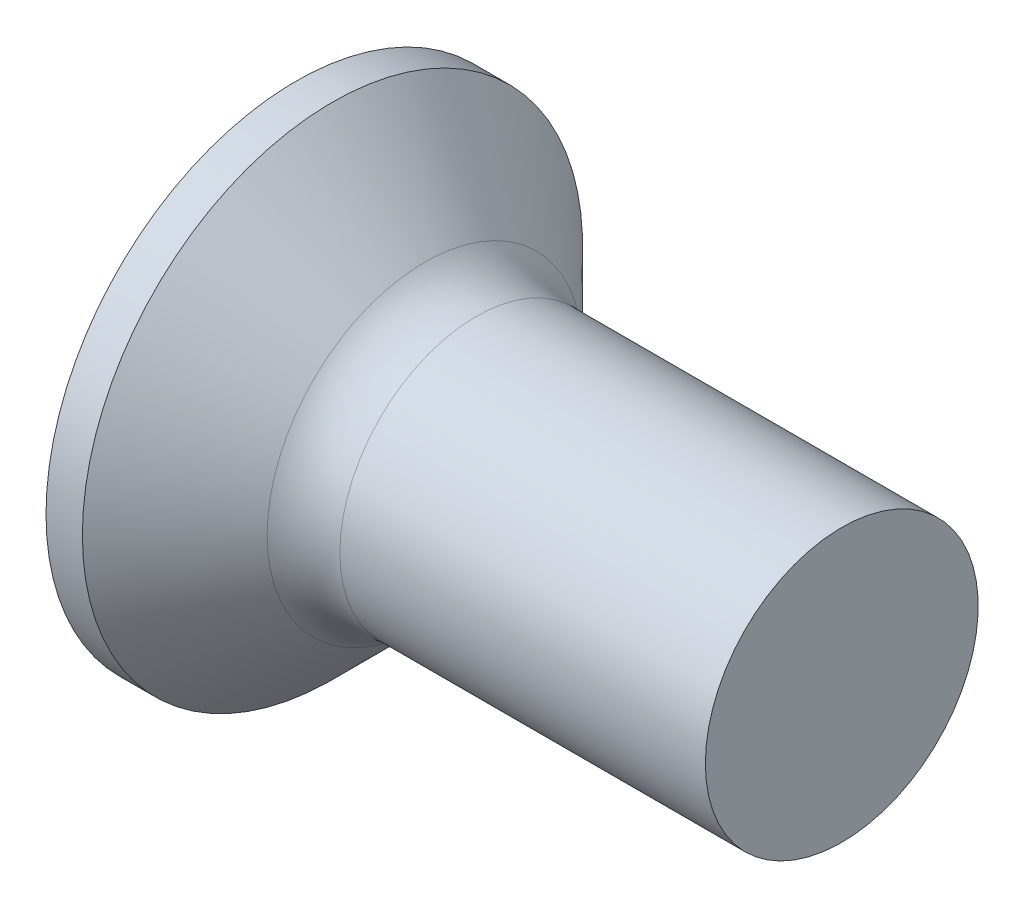
ISO-10303-21;
HEADER;
FILE_DESCRIPTION(('STEP AP214'),'2;1');
FILE_NAME('part.step','',(''),(''),'','','');
FILE_SCHEMA(('AUTOMOTIVE_DESIGN { 1 0 10303 214 1 1 1 1 }'));
ENDSEC;
DATA;
#1=APPLICATION_CONTEXT('core data for automotive mechanical design processes');
#2=APPLICATION_PROTOCOL_DEFINITION('international standard','automotive_design',2000,#1);
#3=PRODUCT_CONTEXT('',#1,'mechanical');
#4=PRODUCT('Part','Part','',(#3));
#5=PRODUCT_RELATED_PRODUCT_CATEGORY('part','',(#4));
#6=PRODUCT_DEFINITION_FORMATION('','',#4);
#7=PRODUCT_DEFINITION_CONTEXT('part definition',#1,'design');
#8=PRODUCT_DEFINITION('design','',#6,#7);
#9=PRODUCT_DEFINITION_SHAPE('','',#8);
#10=(LENGTH_UNIT() NAMED_UNIT(*) SI_UNIT(.MILLI.,.METRE.));
#11=(NAMED_UNIT(*) PLANE_ANGLE_UNIT() SI_UNIT($,.RADIAN.));
#12=(NAMED_UNIT(*) SI_UNIT($,.STERADIAN.) SOLID_ANGLE_UNIT());
#13=UNCERTAINTY_MEASURE_WITH_UNIT(LENGTH_MEASURE(1.E-05),#10,'distance_accuracy_value','');
#14=(GEOMETRIC_REPRESENTATION_CONTEXT(3) GLOBAL_UNCERTAINTY_ASSIGNED_CONTEXT((#13)) GLOBAL_UNIT_ASSIGNED_CONTEXT((#10,
#11,#12)) REPRESENTATION_CONTEXT('',''));
#15=CARTESIAN_POINT('',(0.,0.,0.));
#16=DIRECTION('',(0.,0.,1.));
#17=DIRECTION('',(1.,0.,0.));
#18=AXIS2_PLACEMENT_3D('',#15,#16,#17);
#19=CARTESIAN_POINT('',(5.75178571428571,0.,0.));
#20=DIRECTION('',(-1.,0.,0.));
#21=DIRECTION('',(0.,-1.,0.));
#22=AXIS2_PLACEMENT_3D('',#19,#20,#21);
#23=SPHERICAL_SURFACE('',#22,5.75178571428571);
#24=CARTESIAN_POINT('',(0.699999999999999,0.,0.));
#25=DIRECTION('',(-1.,0.,0.));
#26=DIRECTION('',(0.,0.,1.));
#27=AXIS2_PLACEMENT_3D('',#24,#25,#26);
#28=CIRCLE('',#27,2.75);
#29=CARTESIAN_POINT('',(0.699999999999999,0.,2.75));
#30=VERTEX_POINT('',#29);
#31=EDGE_CURVE('E223',#30,#30,#28,.T.);
#32=ORIENTED_EDGE('',*,*,#31,.T.);
#33=EDGE_LOOP('',(#32));
#34=FACE_BOUND('',#33,.T.);
#35=CARTESIAN_POINT('',(5.75178571428571,0.369999999999999,0.));
#36=DIRECTION('',(0.,-1.,0.));
#37=DIRECTION('',(0.,0.,-1.));
#38=AXIS2_PLACEMENT_3D('',#35,#36,#37);
#39=CIRCLE('',#38,5.73987272533644);
#40=CARTESIAN_POINT('',(0.198367443424474,0.370000000000005,-1.45109765761156));
#41=VERTEX_POINT('',#40);
#42=CARTESIAN_POINT('',(0.0425671244924349,0.370000000000002,-0.592420456280884));
#43=VERTEX_POINT('',#42);
#44=EDGE_CURVE('E304',#41,#43,#39,.F.);
#45=ORIENTED_EDGE('',*,*,#44,.T.);
#46=CARTESIAN_POINT('',(0.0425671244924332,0.,0.));
#47=DIRECTION('',(1.,0.,0.));
#48=DIRECTION('',(0.,0.,-1.));
#49=AXIS2_PLACEMENT_3D('',#46,#47,#48);
#50=CIRCLE('',#49,0.698471185533127);
#51=CARTESIAN_POINT('',(0.0425671244924336,0.592420456280881,-0.37));
#52=VERTEX_POINT('',#51);
#53=EDGE_CURVE('E340',#43,#52,#50,.T.);
#54=ORIENTED_EDGE('',*,*,#53,.T.);
#55=CARTESIAN_POINT('',(5.75178571428571,0.,-0.369999999999999));
#56=DIRECTION('',(0.,0.,1.));
#57=DIRECTION('',(1.,0.,0.));
#58=AXIS2_PLACEMENT_3D('',#55,#56,#57);
#59=CIRCLE('',#58,5.73987272533644);
#60=CARTESIAN_POINT('',(0.198367443424474,1.45109765761157,-0.37));
#61=VERTEX_POINT('',#60);
#62=EDGE_CURVE('E245',#52,#61,#59,.F.);
#63=ORIENTED_EDGE('',*,*,#62,.T.);
#64=CARTESIAN_POINT('',(5.22559114829425,-1.05538320204419,0.));
#65=DIRECTION('',(0.446197753347436,0.894934391398443,0.));
#66=DIRECTION('',(-0.894934391398443,0.446197753347436,0.));
#67=AXIS2_PLACEMENT_3D('',#64,#65,#66);
#68=CIRCLE('',#67,5.629593633525);
#69=CARTESIAN_POINT('',(0.198367443424474,1.45109765761157,0.370000000000001));
#70=VERTEX_POINT('',#69);
#71=EDGE_CURVE('E249',#70,#61,#68,.F.);
#72=ORIENTED_EDGE('',*,*,#71,.F.);
#73=CARTESIAN_POINT('',(5.75178571428571,0.,0.370000000000002));
#74=DIRECTION('',(0.,0.,-1.));
#75=DIRECTION('',(-1.,0.,0.));
#76=AXIS2_PLACEMENT_3D('',#73,#74,#75);
#77=CIRCLE('',#76,5.73987272533644);
#78=CARTESIAN_POINT('',(0.0425671244924336,0.592420456280882,0.369999999999999));
#79=VERTEX_POINT('',#78);
#80=EDGE_CURVE('E242',#70,#79,#77,.F.);
#81=ORIENTED_EDGE('',*,*,#80,.T.);
#82=CARTESIAN_POINT('',(0.0425671244924352,0.369999999999998,0.592420456280886));
#83=VERTEX_POINT('',#82);
#84=EDGE_CURVE('E728',#79,#83,#50,.T.);
#85=ORIENTED_EDGE('',*,*,#84,.T.);
#86=CARTESIAN_POINT('',(0.198367443424474,0.369999999999995,1.45109765761157));
#87=VERTEX_POINT('',#86);
#88=EDGE_CURVE('E271',#83,#87,#39,.F.);
#89=ORIENTED_EDGE('',*,*,#88,.T.);
#90=CARTESIAN_POINT('',(5.22559114829425,0.,-1.05538320204419));
#91=DIRECTION('',(0.446197753347436,0.,0.894934391398443));
#92=DIRECTION('',(0.894934391398443,0.,-0.446197753347436));
#93=AXIS2_PLACEMENT_3D('',#90,#91,#92);
#94=CIRCLE('',#93,5.629593633525);
#95=CARTESIAN_POINT('',(0.198367443424474,-0.370000000000006,1.45109765761156));
#96=VERTEX_POINT('',#95);
#97=EDGE_CURVE('E43',#96,#87,#94,.F.);
#98=ORIENTED_EDGE('',*,*,#97,.F.);
#99=CARTESIAN_POINT('',(5.75178571428571,-0.370000000000002,0.));
#100=DIRECTION('',(0.,1.,0.));
#101=DIRECTION('',(0.,0.,1.));
#102=AXIS2_PLACEMENT_3D('',#99,#100,#101);
#103=CIRCLE('',#102,5.73987272533644);
#104=CARTESIAN_POINT('',(0.0425671244924341,-0.370000000000001,0.592420456280884));
#105=VERTEX_POINT('',#104);
#106=EDGE_CURVE('E275',#96,#105,#103,.F.);
#107=ORIENTED_EDGE('',*,*,#106,.T.);
#108=CARTESIAN_POINT('',(0.0425671244924336,-0.592420456280882,0.369999999999999));
#109=VERTEX_POINT('',#108);
#110=EDGE_CURVE('E423',#105,#109,#50,.T.);
#111=ORIENTED_EDGE('',*,*,#110,.T.);
#112=CARTESIAN_POINT('',(0.198367443424474,-1.45109765761156,0.369999999999999));
#113=VERTEX_POINT('',#112);
#114=EDGE_CURVE('E241',#109,#113,#77,.F.);
#115=ORIENTED_EDGE('',*,*,#114,.T.);
#116=CARTESIAN_POINT('',(5.22559114829425,1.05538320204419,0.));
#117=DIRECTION('',(0.446197753347435,-0.894934391398443,0.));
#118=DIRECTION('',(0.894934391398443,0.446197753347435,0.));
#119=AXIS2_PLACEMENT_3D('',#116,#117,#118);
#120=CIRCLE('',#119,5.629593633525);
#121=CARTESIAN_POINT('',(0.198367443424474,-1.45109765761156,-0.37));
#122=VERTEX_POINT('',#121);
#123=EDGE_CURVE('E239',#122,#113,#120,.F.);
#124=ORIENTED_EDGE('',*,*,#123,.F.);
#125=CARTESIAN_POINT('',(0.0425671244924336,-0.592420456280881,-0.37));
#126=VERTEX_POINT('',#125);
#127=EDGE_CURVE('E246',#122,#126,#59,.F.);
#128=ORIENTED_EDGE('',*,*,#127,.T.);
#129=CARTESIAN_POINT('',(0.0425671244924348,-0.369999999999997,-0.592420456280887));
#130=VERTEX_POINT('',#129);
#131=EDGE_CURVE('E371',#126,#130,#50,.T.);
#132=ORIENTED_EDGE('',*,*,#131,.T.);
#133=CARTESIAN_POINT('',(0.198367443424474,-0.369999999999994,-1.45109765761156));
#134=VERTEX_POINT('',#133);
#135=EDGE_CURVE('E277',#130,#134,#103,.F.);
#136=ORIENTED_EDGE('',*,*,#135,.T.);
#137=CARTESIAN_POINT('',(5.22559114829425,0.,1.05538320204419));
#138=DIRECTION('',(0.446197753347435,0.,-0.894934391398443));
#139=DIRECTION('',(-0.894934391398443,0.,-0.446197753347435));
#140=AXIS2_PLACEMENT_3D('',#137,#138,#139);
#141=CIRCLE('',#140,5.629593633525);
#142=EDGE_CURVE('E252',#41,#134,#141,.F.);
#143=ORIENTED_EDGE('',*,*,#142,.F.);
#144=EDGE_LOOP('',(#45,#54,#63,#72,#81,#85,#89,#98,#107,#111,#115,#124,#128,#132,#136,#143));
#145=FACE_BOUND('',#144,.T.);
#146=ADVANCED_FACE('F35',(#34,#145),#23,.T.);
#147=CARTESIAN_POINT('',(2.08,0.512950428676215,-0.37));
#148=DIRECTION('',(0.,0.,1.));
#149=DIRECTION('',(1.,0.,0.));
#150=AXIS2_PLACEMENT_3D('',#147,#148,#149);
#151=PLANE('',#150);
#152=ORIENTED_EDGE('',*,*,#62,.F.);
#153=CARTESIAN_POINT('',(-0.986108633839049,0.675737444130956,-0.37));
#154=CARTESIAN_POINT('',(-0.774401024917671,0.658853686256421,-0.37));
#155=CARTESIAN_POINT('',(-0.56270392162146,0.641835849346198,-0.37));
#156=CARTESIAN_POINT('',(-0.139335591881705,0.607430344801114,-0.37));
#157=CARTESIAN_POINT('',(0.0723356339683206,0.590042669870087,-0.37));
#158=CARTESIAN_POINT('',(0.495638906041735,0.554796481702076,-0.37));
#159=CARTESIAN_POINT('',(0.707270952279083,0.536937968633181,-0.37));
#160=CARTESIAN_POINT('',(1.13047821918516,0.500589740538851,-0.37));
#161=CARTESIAN_POINT('',(1.34205344057783,0.482100033980559,-0.37));
#162=CARTESIAN_POINT('',(1.7126422349985,0.448931877712391,-0.37));
#163=CARTESIAN_POINT('',(1.87167298820047,0.434445978314768,-0.37));
#164=CARTESIAN_POINT('',(2.18967047903985,0.404800340258253,-0.37));
#165=CARTESIAN_POINT('',(2.34863721722438,0.3896406074874,-0.37));
#166=CARTESIAN_POINT('',(2.66648832719461,0.358378663830571,-0.37));
#167=CARTESIAN_POINT('',(2.82537269367797,0.342276398422203,-0.37));
#168=CARTESIAN_POINT('',(3.06358912313363,0.31705487368504,-0.37));
#169=CARTESIAN_POINT('',(3.14297750534347,0.308469532933521,-0.37));
#170=CARTESIAN_POINT('',(3.30170304596355,0.290830230925067,-0.37));
#171=CARTESIAN_POINT('',(3.38104020374595,0.281776264030691,-0.37));
#172=CARTESIAN_POINT('',(3.460343956577,0.27243176300921,-0.37));
#173=B_SPLINE_CURVE_WITH_KNOTS('',3,(#153,#154,#155,#156,#157,#158,#159,#160,#161,#162,#163,
#164,#165,#166,#167,#168,#169,#170,#171,#172),.UNSPECIFIED.,.F.,.F.,(4,2,2,2,2,2,2,2,2,4),(0.,
0.637139595455107,1.27429177208145,1.91144372124687,2.54858712669655,3.02765347728825,
3.50671564256163,3.98580554743446,4.22535810389142,4.46491354276891),.UNSPECIFIED.);
#174=CARTESIAN_POINT('',(2.08,0.415013252800436,-0.37));
#175=VERTEX_POINT('',#174);
#176=EDGE_CURVE('E396',#52,#175,#173,.T.);
#177=ORIENTED_EDGE('',*,*,#176,.T.);
#178=DIRECTION('',(0.,1.,0.));
#179=VECTOR('',#178,1.);
#180=CARTESIAN_POINT('',(2.08,-0.512950428676216,-0.37));
#181=LINE('',#180,#179);
#182=CARTESIAN_POINT('',(2.08,0.512950428676216,-0.37));
#183=VERTEX_POINT('',#182);
#184=EDGE_CURVE('E331',#175,#183,#181,.T.);
#185=ORIENTED_EDGE('',*,*,#184,.T.);
#186=DIRECTION('',(0.894934391398442,-0.446197753347436,0.));
#187=VECTOR('',#186,1.);
#188=CARTESIAN_POINT('',(0.,1.55,-0.37));
#189=LINE('',#188,#187);
#190=EDGE_CURVE('E220',#61,#183,#189,.T.);
#191=ORIENTED_EDGE('',*,*,#190,.F.);
#192=EDGE_LOOP('',(#152,#177,#185,#191));
#193=FACE_BOUND('',#192,.T.);
#194=ADVANCED_FACE('F188',(#193),#151,.T.);
#195=CARTESIAN_POINT('',(2.08,-0.512950428676216,-0.37));
#196=VERTEX_POINT('',#195);
#197=CARTESIAN_POINT('',(2.08,-0.415013252800436,-0.37));
#198=VERTEX_POINT('',#197);
#199=EDGE_CURVE('E229',#196,#198,#181,.T.);
#200=ORIENTED_EDGE('',*,*,#199,.T.);
#201=CARTESIAN_POINT('',(-0.986108633839049,-0.675737444130956,-0.37));
#202=CARTESIAN_POINT('',(-0.774401024917671,-0.658853686256421,-0.37));
#203=CARTESIAN_POINT('',(-0.56270392162146,-0.641835849346198,-0.37));
#204=CARTESIAN_POINT('',(-0.139335591881705,-0.607430344801114,-0.37));
#205=CARTESIAN_POINT('',(0.0723356339683208,-0.590042669870087,-0.37));
#206=CARTESIAN_POINT('',(0.495638906041735,-0.554796481702076,-0.37));
#207=CARTESIAN_POINT('',(0.707270952279084,-0.536937968633181,-0.37));
#208=CARTESIAN_POINT('',(1.13047821918516,-0.500589740538851,-0.37));
#209=CARTESIAN_POINT('',(1.34205344057783,-0.482100033980558,-0.37));
#210=CARTESIAN_POINT('',(1.7126422349985,-0.44893187771239,-0.37));
#211=CARTESIAN_POINT('',(1.87167298820047,-0.434445978314767,-0.37));
#212=CARTESIAN_POINT('',(2.18967047903985,-0.404800340258253,-0.37));
#213=CARTESIAN_POINT('',(2.34863721722438,-0.3896406074874,-0.37));
#214=CARTESIAN_POINT('',(2.66648832719461,-0.358378663830571,-0.37));
#215=CARTESIAN_POINT('',(2.82537269367797,-0.342276398422203,-0.37));
#216=CARTESIAN_POINT('',(3.06358912313363,-0.31705487368504,-0.37));
#217=CARTESIAN_POINT('',(3.14297750534347,-0.30846953293352,-0.37));
#218=CARTESIAN_POINT('',(3.30170304596355,-0.290830230925067,-0.37));
#219=CARTESIAN_POINT('',(3.38104020374595,-0.281776264030691,-0.37));
#220=CARTESIAN_POINT('',(3.460343956577,-0.27243176300921,-0.37));
#221=B_SPLINE_CURVE_WITH_KNOTS('',3,(#201,#202,#203,#204,#205,#206,#207,#208,#209,#210,#211,
#212,#213,#214,#215,#216,#217,#218,#219,#220),.UNSPECIFIED.,.F.,.F.,(4,2,2,2,2,2,2,2,2,4),(0.,
0.637139595455106,1.27429177208145,1.91144372124687,2.54858712669655,3.02765347728825,
3.50671564256163,3.98580554743446,4.22535810389142,4.46491354276891),.UNSPECIFIED.);
#222=EDGE_CURVE('E383',#198,#126,#221,.F.);
#223=ORIENTED_EDGE('',*,*,#222,.T.);
#224=ORIENTED_EDGE('',*,*,#127,.F.);
#225=DIRECTION('',(0.894934391398443,0.446197753347435,0.));
#226=VECTOR('',#225,1.);
#227=CARTESIAN_POINT('',(0.,-1.55,-0.37));
#228=LINE('',#227,#226);
#229=EDGE_CURVE('E58',#122,#196,#228,.T.);
#230=ORIENTED_EDGE('',*,*,#229,.T.);
#231=EDGE_LOOP('',(#200,#223,#224,#230));
#232=FACE_BOUND('',#231,.T.);
#233=ADVANCED_FACE('F194',(#232),#151,.T.);
#234=CARTESIAN_POINT('',(2.08,-0.512950428676216,0.37));
#235=DIRECTION('',(0.,0.,-1.));
#236=DIRECTION('',(-1.,0.,0.));
#237=AXIS2_PLACEMENT_3D('',#234,#235,#236);
#238=PLANE('',#237);
#239=DIRECTION('',(0.,-1.,0.));
#240=VECTOR('',#239,1.);
#241=CARTESIAN_POINT('',(2.08,0.512950428676216,0.37));
#242=LINE('',#241,#240);
#243=CARTESIAN_POINT('',(2.08,0.512950428676216,0.37));
#244=VERTEX_POINT('',#243);
#245=CARTESIAN_POINT('',(2.08,0.415013252800436,0.37));
#246=VERTEX_POINT('',#245);
#247=EDGE_CURVE('E315',#244,#246,#242,.T.);
#248=ORIENTED_EDGE('',*,*,#247,.T.);
#249=CARTESIAN_POINT('',(-0.986108633839049,0.675737444130957,0.369999999999999));
#250=CARTESIAN_POINT('',(-0.774401024917671,0.658853686256422,0.369999999999999));
#251=CARTESIAN_POINT('',(-0.56270392162146,0.641835849346199,0.369999999999999));
#252=CARTESIAN_POINT('',(-0.139335591881705,0.607430344801115,0.369999999999999));
#253=CARTESIAN_POINT('',(0.0723356339683208,0.590042669870088,0.369999999999999));
#254=CARTESIAN_POINT('',(0.495638906041735,0.554796481702077,0.369999999999999));
#255=CARTESIAN_POINT('',(0.707270952279083,0.536937968633182,0.369999999999999));
#256=CARTESIAN_POINT('',(1.13047821918516,0.500589740538852,0.37));
#257=CARTESIAN_POINT('',(1.34205344057783,0.482100033980559,0.37));
#258=CARTESIAN_POINT('',(1.7126422349985,0.448931877712391,0.37));
#259=CARTESIAN_POINT('',(1.87167298820047,0.434445978314768,0.37));
#260=CARTESIAN_POINT('',(2.18967047903985,0.404800340258252,0.37));
#261=CARTESIAN_POINT('',(2.34863721722438,0.389640607487399,0.37));
#262=CARTESIAN_POINT('',(2.66648832719461,0.358378663830571,0.37));
#263=CARTESIAN_POINT('',(2.82537269367797,0.342276398422203,0.37));
#264=CARTESIAN_POINT('',(3.06358912313363,0.31705487368504,0.37));
#265=CARTESIAN_POINT('',(3.14297750534347,0.30846953293352,0.37));
#266=CARTESIAN_POINT('',(3.30170304596355,0.290830230925066,0.370000000000001));
#267=CARTESIAN_POINT('',(3.38104020374595,0.28177626403069,0.370000000000001));
#268=CARTESIAN_POINT('',(3.460343956577,0.272431763009209,0.370000000000001));
#269=B_SPLINE_CURVE_WITH_KNOTS('',3,(#249,#250,#251,#252,#253,#254,#255,#256,#257,#258,#259,
#260,#261,#262,#263,#264,#265,#266,#267,#268),.UNSPECIFIED.,.F.,.F.,(4,2,2,2,2,2,2,2,2,4),(0.,
0.637139595455107,1.27429177208145,1.91144372124687,2.54858712669655,3.02765347728825,
3.50671564256163,3.98580554743446,4.22535810389142,4.46491354276891),.UNSPECIFIED.);
#270=EDGE_CURVE('E410',#246,#79,#269,.F.);
#271=ORIENTED_EDGE('',*,*,#270,.T.);
#272=ORIENTED_EDGE('',*,*,#80,.F.);
#273=DIRECTION('',(0.894934391398442,-0.446197753347436,0.));
#274=VECTOR('',#273,1.);
#275=CARTESIAN_POINT('',(0.,1.55,0.37));
#276=LINE('',#275,#274);
#277=EDGE_CURVE('E226',#70,#244,#276,.T.);
#278=ORIENTED_EDGE('',*,*,#277,.T.);
#279=EDGE_LOOP('',(#248,#271,#272,#278));
#280=FACE_BOUND('',#279,.T.);
#281=ADVANCED_FACE('F431',(#280),#238,.T.);
#282=ORIENTED_EDGE('',*,*,#114,.F.);
#283=CARTESIAN_POINT('',(-0.986108633926465,-0.675737444137926,0.369999999999999));
#284=CARTESIAN_POINT('',(-0.774401024995322,-0.658853686262652,0.369999999999999));
#285=CARTESIAN_POINT('',(-0.562703921689346,-0.641835849351682,0.369999999999999));
#286=CARTESIAN_POINT('',(-0.139335591930065,-0.607430344805079,0.369999999999999));
#287=CARTESIAN_POINT('',(0.0723356339297242,-0.59004266987328,0.369999999999999));
#288=CARTESIAN_POINT('',(0.495638906032911,-0.554796481702833,0.369999999999999));
#289=CARTESIAN_POINT('',(0.707270952290267,-0.536937968632252,0.369999999999999));
#290=CARTESIAN_POINT('',(1.13047821923635,-0.500589740534424,0.37));
#291=CARTESIAN_POINT('',(1.34205344064901,-0.482100033974318,0.37));
#292=CARTESIAN_POINT('',(1.71264223508966,-0.448931877704134,0.37));
#293=CARTESIAN_POINT('',(1.87167298829162,-0.434445978306401,0.37));
#294=CARTESIAN_POINT('',(2.18967047913098,-0.404800340249625,0.37));
#295=CARTESIAN_POINT('',(2.3486372173155,-0.389640607478622,0.37));
#296=CARTESIAN_POINT('',(2.66648832728569,-0.358378663821427,0.37));
#297=CARTESIAN_POINT('',(2.82537269376903,-0.342276398412842,0.37));
#298=CARTESIAN_POINT('',(3.06358912322466,-0.317054873675262,0.370000000000001));
#299=CARTESIAN_POINT('',(3.14297750543448,-0.308469532923588,0.370000000000001));
#300=CARTESIAN_POINT('',(3.30170304605452,-0.290830230914778,0.370000000000001));
#301=CARTESIAN_POINT('',(3.3810402038369,-0.2817762640202,0.370000000000001));
#302=CARTESIAN_POINT('',(3.46034395666792,-0.272431762998485,0.370000000000001));
#303=B_SPLINE_CURVE_WITH_KNOTS('',3,(#283,#284,#285,#286,#287,#288,#289,#290,#291,#292,#293,
#294,#295,#296,#297,#298,#299,#300,#301,#302),.UNSPECIFIED.,.F.,.F.,(4,2,2,2,2,2,2,2,2,4),(0.,
0.637139595484484,1.27429177214021,1.91144372136586,2.54858712687577,3.02765347746747,
3.50671564274086,3.9858055476137,4.22535810407066,4.46491354294815),.UNSPECIFIED.);
#304=CARTESIAN_POINT('',(2.08,-0.415013252800436,0.37));
#305=VERTEX_POINT('',#304);
#306=EDGE_CURVE('E424',#109,#305,#303,.T.);
#307=ORIENTED_EDGE('',*,*,#306,.T.);
#308=CARTESIAN_POINT('',(2.08,-0.512950428676216,0.37));
#309=VERTEX_POINT('',#308);
#310=EDGE_CURVE('E317',#305,#309,#242,.T.);
#311=ORIENTED_EDGE('',*,*,#310,.T.);
#312=DIRECTION('',(0.894934391398443,0.446197753347435,0.));
#313=VECTOR('',#312,1.);
#314=CARTESIAN_POINT('',(0.,-1.55,0.369999999999999));
#315=LINE('',#314,#313);
#316=EDGE_CURVE('E308',#113,#309,#315,.T.);
#317=ORIENTED_EDGE('',*,*,#316,.F.);
#318=EDGE_LOOP('',(#282,#307,#311,#317));
#319=FACE_BOUND('',#318,.T.);
#320=ADVANCED_FACE('F435',(#319),#238,.T.);
#321=CARTESIAN_POINT('',(2.08,-0.512950428676216,-0.37));
#322=DIRECTION('',(1.,0.,0.));
#323=DIRECTION('',(0.,0.,-1.));
#324=AXIS2_PLACEMENT_3D('',#321,#322,#323);
#325=PLANE('',#324);
#326=CARTESIAN_POINT('',(2.08,0.,0.));
#327=DIRECTION('',(-1.,0.,0.));
#328=DIRECTION('',(0.,0.,1.));
#329=AXIS2_PLACEMENT_3D('',#326,#327,#328);
#330=CIRCLE('',#329,0.555999999999999);
#331=CARTESIAN_POINT('',(2.08,-0.214517732882119,-0.512950428676217));
#332=VERTEX_POINT('',#331);
#333=CARTESIAN_POINT('',(2.08,-0.369999999999999,-0.415013252800437));
#334=VERTEX_POINT('',#333);
#335=EDGE_CURVE('E358',#332,#334,#330,.T.);
#336=ORIENTED_EDGE('',*,*,#335,.F.);
#337=DIRECTION('',(0.,-1.,0.));
#338=VECTOR('',#337,1.);
#339=CARTESIAN_POINT('',(2.08,0.370000000000002,-0.512950428676215));
#340=LINE('',#339,#338);
#341=CARTESIAN_POINT('',(2.08,-0.369999999999998,-0.512950428676217));
#342=VERTEX_POINT('',#341);
#343=EDGE_CURVE('E292',#332,#342,#340,.T.);
#344=ORIENTED_EDGE('',*,*,#343,.T.);
#345=DIRECTION('',(0.,0.,-1.));
#346=VECTOR('',#345,1.);
#347=CARTESIAN_POINT('',(2.08,-0.370000000000002,0.512950428676214));
#348=LINE('',#347,#346);
#349=EDGE_CURVE('E296',#334,#342,#348,.T.);
#350=ORIENTED_EDGE('',*,*,#349,.F.);
#351=EDGE_LOOP('',(#336,#344,#350));
#352=FACE_BOUND('',#351,.T.);
#353=ADVANCED_FACE('F446',(#352),#325,.F.);
#354=CARTESIAN_POINT('',(2.08,-0.512950428676216,-0.214517732882121));
#355=VERTEX_POINT('',#354);
#356=EDGE_CURVE('E751',#198,#355,#330,.T.);
#357=ORIENTED_EDGE('',*,*,#356,.F.);
#358=ORIENTED_EDGE('',*,*,#199,.F.);
#359=DIRECTION('',(0.,0.,1.));
#360=VECTOR('',#359,1.);
#361=CARTESIAN_POINT('',(2.08,-0.512950428676216,-0.37));
#362=LINE('',#361,#360);
#363=EDGE_CURVE('E311',#196,#355,#362,.T.);
#364=ORIENTED_EDGE('',*,*,#363,.T.);
#365=EDGE_LOOP('',(#357,#358,#364));
#366=FACE_BOUND('',#365,.T.);
#367=ADVANCED_FACE('F579',(#366),#325,.F.);
#368=CARTESIAN_POINT('',(2.08,-0.512950428676216,0.214517732882121));
#369=VERTEX_POINT('',#368);
#370=EDGE_CURVE('E748',#369,#305,#330,.T.);
#371=ORIENTED_EDGE('',*,*,#370,.F.);
#372=EDGE_CURVE('E314',#369,#309,#362,.T.);
#373=ORIENTED_EDGE('',*,*,#372,.T.);
#374=ORIENTED_EDGE('',*,*,#310,.F.);
#375=EDGE_LOOP('',(#371,#373,#374));
#376=FACE_BOUND('',#375,.T.);
#377=ADVANCED_FACE('F590',(#376),#325,.F.);
#378=CARTESIAN_POINT('',(2.08,-0.370000000000001,0.415013252800435));
#379=VERTEX_POINT('',#378);
#380=CARTESIAN_POINT('',(2.08,-0.214517732882123,0.512950428676215));
#381=VERTEX_POINT('',#380);
#382=EDGE_CURVE('E738',#379,#381,#330,.T.);
#383=ORIENTED_EDGE('',*,*,#382,.F.);
#384=CARTESIAN_POINT('',(2.08,-0.370000000000002,0.512950428676215));
#385=VERTEX_POINT('',#384);
#386=EDGE_CURVE('E293',#385,#379,#348,.T.);
#387=ORIENTED_EDGE('',*,*,#386,.F.);
#388=DIRECTION('',(0.,1.,0.));
#389=VECTOR('',#388,1.);
#390=CARTESIAN_POINT('',(2.08,-0.370000000000002,0.512950428676214));
#391=LINE('',#390,#389);
#392=EDGE_CURVE('E297',#385,#381,#391,.T.);
#393=ORIENTED_EDGE('',*,*,#392,.T.);
#394=EDGE_LOOP('',(#383,#387,#393));
#395=FACE_BOUND('',#394,.T.);
#396=ADVANCED_FACE('F600',(#395),#325,.F.);
#397=CARTESIAN_POINT('',(2.08,0.21451773288212,0.512950428676216));
#398=VERTEX_POINT('',#397);
#399=CARTESIAN_POINT('',(2.08,0.369999999999998,0.415013252800437));
#400=VERTEX_POINT('',#399);
#401=EDGE_CURVE('E359',#398,#400,#330,.T.);
#402=ORIENTED_EDGE('',*,*,#401,.F.);
#403=CARTESIAN_POINT('',(2.08,0.369999999999998,0.512950428676217));
#404=VERTEX_POINT('',#403);
#405=EDGE_CURVE('E300',#398,#404,#391,.T.);
#406=ORIENTED_EDGE('',*,*,#405,.T.);
#407=DIRECTION('',(0.,0.,1.));
#408=VECTOR('',#407,1.);
#409=CARTESIAN_POINT('',(2.08,0.370000000000002,-0.512950428676215));
#410=LINE('',#409,#408);
#411=EDGE_CURVE('E273',#400,#404,#410,.T.);
#412=ORIENTED_EDGE('',*,*,#411,.F.);
#413=EDGE_LOOP('',(#402,#406,#412));
#414=FACE_BOUND('',#413,.T.);
#415=ADVANCED_FACE('F610',(#414),#325,.F.);
#416=CARTESIAN_POINT('',(2.08,0.512950428676216,0.214517732882122));
#417=VERTEX_POINT('',#416);
#418=EDGE_CURVE('E765',#246,#417,#330,.T.);
#419=ORIENTED_EDGE('',*,*,#418,.F.);
#420=ORIENTED_EDGE('',*,*,#247,.F.);
#421=DIRECTION('',(0.,0.,-1.));
#422=VECTOR('',#421,1.);
#423=CARTESIAN_POINT('',(2.08,0.512950428676216,0.37));
#424=LINE('',#423,#422);
#425=EDGE_CURVE('E318',#244,#417,#424,.T.);
#426=ORIENTED_EDGE('',*,*,#425,.T.);
#427=EDGE_LOOP('',(#419,#420,#426));
#428=FACE_BOUND('',#427,.T.);
#429=ADVANCED_FACE('F620',(#428),#325,.F.);
#430=CARTESIAN_POINT('',(2.08,0.512950428676215,-0.214517732882122));
#431=VERTEX_POINT('',#430);
#432=EDGE_CURVE('E357',#431,#175,#330,.T.);
#433=ORIENTED_EDGE('',*,*,#432,.F.);
#434=EDGE_CURVE('E320',#431,#183,#424,.T.);
#435=ORIENTED_EDGE('',*,*,#434,.T.);
#436=ORIENTED_EDGE('',*,*,#184,.F.);
#437=EDGE_LOOP('',(#433,#435,#436));
#438=FACE_BOUND('',#437,.T.);
#439=ADVANCED_FACE('F447',(#438),#325,.F.);
#440=CARTESIAN_POINT('',(2.08,0.512950428676216,0.37));
#441=DIRECTION('',(0.446197753347436,0.894934391398443,0.));
#442=DIRECTION('',(-0.894934391398443,0.446197753347436,0.));
#443=AXIS2_PLACEMENT_3D('',#440,#441,#442);
#444=PLANE('',#443);
#445=CARTESIAN_POINT('',(2.96992136525496,0.0692520775466315,0.));
#446=DIRECTION('',(0.446197753347436,0.894934391398443,0.));
#447=DIRECTION('',(-0.894934391398443,0.446197753347436,0.));
#448=AXIS2_PLACEMENT_3D('',#445,#446,#447);
#449=ELLIPSE('',#448,1.10661838241671,0.488890162283964);
#450=EDGE_CURVE('E282',#417,#431,#449,.F.);
#451=ORIENTED_EDGE('',*,*,#450,.F.);
#452=ORIENTED_EDGE('',*,*,#425,.F.);
#453=ORIENTED_EDGE('',*,*,#277,.F.);
#454=ORIENTED_EDGE('',*,*,#71,.T.);
#455=ORIENTED_EDGE('',*,*,#190,.T.);
#456=ORIENTED_EDGE('',*,*,#434,.F.);
#457=EDGE_LOOP('',(#451,#452,#453,#454,#455,#456));
#458=FACE_BOUND('',#457,.T.);
#459=ADVANCED_FACE('F443',(#458),#444,.F.);
#460=CARTESIAN_POINT('',(2.08,-0.512950428676216,-0.37));
#461=DIRECTION('',(0.446197753347435,-0.894934391398443,0.));
#462=DIRECTION('',(0.894934391398443,0.446197753347435,0.));
#463=AXIS2_PLACEMENT_3D('',#460,#461,#462);
#464=PLANE('',#463);
#465=CARTESIAN_POINT('',(2.96992136525496,-0.0692520775466322,0.));
#466=DIRECTION('',(0.446197753347435,-0.894934391398443,0.));
#467=DIRECTION('',(-0.894934391398443,-0.446197753347435,0.));
#468=AXIS2_PLACEMENT_3D('',#465,#466,#467);
#469=ELLIPSE('',#468,1.10661838241671,0.488890162283963);
#470=EDGE_CURVE('E430',#355,#369,#469,.F.);
#471=ORIENTED_EDGE('',*,*,#470,.F.);
#472=ORIENTED_EDGE('',*,*,#363,.F.);
#473=ORIENTED_EDGE('',*,*,#229,.F.);
#474=ORIENTED_EDGE('',*,*,#123,.T.);
#475=ORIENTED_EDGE('',*,*,#316,.T.);
#476=ORIENTED_EDGE('',*,*,#372,.F.);
#477=EDGE_LOOP('',(#471,#472,#473,#474,#475,#476));
#478=FACE_BOUND('',#477,.T.);
#479=ADVANCED_FACE('F439',(#478),#464,.F.);
#480=CARTESIAN_POINT('',(2.08,-0.369999999999998,-0.512950428676217));
#481=DIRECTION('',(0.,1.,0.));
#482=DIRECTION('',(-1.,0.,0.));
#483=AXIS2_PLACEMENT_3D('',#480,#481,#482);
#484=PLANE('',#483);
#485=ORIENTED_EDGE('',*,*,#386,.T.);
#486=CARTESIAN_POINT('',(-0.986108633839049,-0.370000000000001,0.675737444130956));
#487=CARTESIAN_POINT('',(-0.774401024917671,-0.370000000000001,0.658853686256421));
#488=CARTESIAN_POINT('',(-0.56270392162146,-0.370000000000001,0.641835849346198));
#489=CARTESIAN_POINT('',(-0.139335591881705,-0.370000000000001,0.607430344801113));
#490=CARTESIAN_POINT('',(0.0723356339683206,-0.370000000000001,0.590042669870087));
#491=CARTESIAN_POINT('',(0.495638906041735,-0.370000000000001,0.554796481702075));
#492=CARTESIAN_POINT('',(0.707270952279083,-0.370000000000001,0.53693796863318));
#493=CARTESIAN_POINT('',(1.13047821918516,-0.370000000000001,0.50058974053885));
#494=CARTESIAN_POINT('',(1.34205344057783,-0.370000000000001,0.482100033980558));
#495=CARTESIAN_POINT('',(1.7126422349985,-0.370000000000001,0.448931877712389));
#496=CARTESIAN_POINT('',(1.87167298820047,-0.370000000000001,0.434445978314766));
#497=CARTESIAN_POINT('',(2.18967047903985,-0.370000000000001,0.404800340258251));
#498=CARTESIAN_POINT('',(2.34863721722438,-0.370000000000001,0.389640607487398));
#499=CARTESIAN_POINT('',(2.66648832719461,-0.370000000000001,0.358378663830569));
#500=CARTESIAN_POINT('',(2.82537269367797,-0.370000000000001,0.342276398422201));
#501=CARTESIAN_POINT('',(3.06358912313363,-0.370000000000002,0.317054873685038));
#502=CARTESIAN_POINT('',(3.14297750534347,-0.370000000000002,0.308469532933518));
#503=CARTESIAN_POINT('',(3.30170304596355,-0.370000000000002,0.290830230925064));
#504=CARTESIAN_POINT('',(3.38104020374595,-0.370000000000002,0.281776264030689));
#505=CARTESIAN_POINT('',(3.460343956577,-0.370000000000002,0.272431763009207));
#506=B_SPLINE_CURVE_WITH_KNOTS('',3,(#486,#487,#488,#489,#490,#491,#492,#493,#494,#495,#496,
#497,#498,#499,#500,#501,#502,#503,#504,#505),.UNSPECIFIED.,.F.,.F.,(4,2,2,2,2,2,2,2,2,4),(0.,
0.637139595455107,1.27429177208145,1.91144372124687,2.54858712669655,3.02765347728825,
3.50671564256163,3.98580554743446,4.22535810389142,4.46491354276891),.UNSPECIFIED.);
#507=EDGE_CURVE('E417',#379,#105,#506,.F.);
#508=ORIENTED_EDGE('',*,*,#507,.T.);
#509=ORIENTED_EDGE('',*,*,#106,.F.);
#510=DIRECTION('',(0.894934391398442,0.,-0.446197753347436));
#511=VECTOR('',#510,1.);
#512=CARTESIAN_POINT('',(0.,-0.370000000000005,1.55));
#513=LINE('',#512,#511);
#514=EDGE_CURVE('E265',#96,#385,#513,.T.);
#515=ORIENTED_EDGE('',*,*,#514,.T.);
#516=EDGE_LOOP('',(#485,#508,#509,#515));
#517=FACE_BOUND('',#516,.T.);
#518=ADVANCED_FACE('F373',(#517),#484,.T.);
#519=CARTESIAN_POINT('',(2.08,0.369999999999998,0.512950428676217));
#520=DIRECTION('',(0.,-1.,0.));
#521=DIRECTION('',(1.,0.,0.));
#522=AXIS2_PLACEMENT_3D('',#519,#520,#521);
#523=PLANE('',#522);
#524=ORIENTED_EDGE('',*,*,#88,.F.);
#525=CARTESIAN_POINT('',(-0.986108633839049,0.369999999999998,0.675737444130957));
#526=CARTESIAN_POINT('',(-0.774401024917671,0.369999999999998,0.658853686256423));
#527=CARTESIAN_POINT('',(-0.56270392162146,0.369999999999998,0.6418358493462));
#528=CARTESIAN_POINT('',(-0.139335591881705,0.369999999999998,0.607430344801115));
#529=CARTESIAN_POINT('',(0.0723356339683208,0.369999999999998,0.590042669870089));
#530=CARTESIAN_POINT('',(0.495638906041735,0.369999999999998,0.554796481702077));
#531=CARTESIAN_POINT('',(0.707270952279083,0.369999999999998,0.536937968633182));
#532=CARTESIAN_POINT('',(1.13047821918516,0.369999999999998,0.500589740538853));
#533=CARTESIAN_POINT('',(1.34205344057783,0.369999999999998,0.48210003398056));
#534=CARTESIAN_POINT('',(1.7126422349985,0.369999999999998,0.448931877712392));
#535=CARTESIAN_POINT('',(1.87167298820047,0.369999999999998,0.434445978314769));
#536=CARTESIAN_POINT('',(2.18967047903985,0.369999999999998,0.404800340258254));
#537=CARTESIAN_POINT('',(2.34863721722438,0.369999999999998,0.389640607487401));
#538=CARTESIAN_POINT('',(2.66648832719461,0.369999999999999,0.358378663830573));
#539=CARTESIAN_POINT('',(2.82537269367797,0.369999999999999,0.342276398422205));
#540=CARTESIAN_POINT('',(3.06358912313363,0.369999999999999,0.317054873685042));
#541=CARTESIAN_POINT('',(3.14297750534347,0.369999999999999,0.308469532933522));
#542=CARTESIAN_POINT('',(3.30170304596355,0.369999999999999,0.290830230925068));
#543=CARTESIAN_POINT('',(3.38104020374595,0.369999999999999,0.281776264030692));
#544=CARTESIAN_POINT('',(3.460343956577,0.369999999999999,0.272431763009211));
#545=B_SPLINE_CURVE_WITH_KNOTS('',3,(#525,#526,#527,#528,#529,#530,#531,#532,#533,#534,#535,
#536,#537,#538,#539,#540,#541,#542,#543,#544),.UNSPECIFIED.,.F.,.F.,(4,2,2,2,2,2,2,2,2,4),(0.,
0.637139595455107,1.27429177208145,1.91144372124687,2.54858712669655,3.02765347728825,
3.50671564256163,3.98580554743446,4.22535810389142,4.46491354276891),.UNSPECIFIED.);
#546=EDGE_CURVE('E404',#83,#400,#545,.T.);
#547=ORIENTED_EDGE('',*,*,#546,.T.);
#548=ORIENTED_EDGE('',*,*,#411,.T.);
#549=DIRECTION('',(0.894934391398442,0.,-0.446197753347436));
#550=VECTOR('',#549,1.);
#551=CARTESIAN_POINT('',(0.,0.369999999999995,1.55));
#552=LINE('',#551,#550);
#553=EDGE_CURVE('E263',#87,#404,#552,.T.);
#554=ORIENTED_EDGE('',*,*,#553,.F.);
#555=EDGE_LOOP('',(#524,#547,#548,#554));
#556=FACE_BOUND('',#555,.T.);
#557=ADVANCED_FACE('F269',(#556),#523,.T.);
#558=CARTESIAN_POINT('',(2.08,-0.370000000000002,0.512950428676214));
#559=DIRECTION('',(0.446197753347436,0.,0.894934391398443));
#560=DIRECTION('',(-0.894934391398443,0.,0.446197753347436));
#561=AXIS2_PLACEMENT_3D('',#558,#559,#560);
#562=PLANE('',#561);
#563=CARTESIAN_POINT('',(2.96992136525496,0.,0.0692520775466314));
#564=DIRECTION('',(0.446197753347436,0.,0.894934391398443));
#565=DIRECTION('',(-0.894934391398443,0.,0.446197753347436));
#566=AXIS2_PLACEMENT_3D('',#563,#564,#565);
#567=ELLIPSE('',#566,1.10661838241671,0.488890162283964);
#568=EDGE_CURVE('E729',#381,#398,#567,.F.);
#569=ORIENTED_EDGE('',*,*,#568,.F.);
#570=ORIENTED_EDGE('',*,*,#392,.F.);
#571=ORIENTED_EDGE('',*,*,#514,.F.);
#572=ORIENTED_EDGE('',*,*,#97,.T.);
#573=ORIENTED_EDGE('',*,*,#553,.T.);
#574=ORIENTED_EDGE('',*,*,#405,.F.);
#575=EDGE_LOOP('',(#569,#570,#571,#572,#573,#574));
#576=FACE_BOUND('',#575,.T.);
#577=ADVANCED_FACE('F261',(#576),#562,.F.);
#578=CARTESIAN_POINT('',(2.08,0.370000000000002,-0.512950428676215));
#579=VERTEX_POINT('',#578);
#580=CARTESIAN_POINT('',(2.08,0.370000000000001,-0.415013252800435));
#581=VERTEX_POINT('',#580);
#582=EDGE_CURVE('E301',#579,#581,#410,.T.);
#583=ORIENTED_EDGE('',*,*,#582,.T.);
#584=CARTESIAN_POINT('',(-0.986108633839049,0.370000000000003,-0.675737444130955));
#585=CARTESIAN_POINT('',(-0.774401024917671,0.370000000000003,-0.65885368625642));
#586=CARTESIAN_POINT('',(-0.56270392162146,0.370000000000003,-0.641835849346197));
#587=CARTESIAN_POINT('',(-0.139335591881705,0.370000000000002,-0.607430344801113));
#588=CARTESIAN_POINT('',(0.0723356339683206,0.370000000000002,-0.590042669870086));
#589=CARTESIAN_POINT('',(0.495638906041735,0.370000000000002,-0.554796481702075));
#590=CARTESIAN_POINT('',(0.707270952279083,0.370000000000002,-0.53693796863318));
#591=CARTESIAN_POINT('',(1.13047821918516,0.370000000000002,-0.50058974053885));
#592=CARTESIAN_POINT('',(1.34205344057783,0.370000000000002,-0.482100033980557));
#593=CARTESIAN_POINT('',(1.7126422349985,0.370000000000002,-0.448931877712389));
#594=CARTESIAN_POINT('',(1.87167298820047,0.370000000000001,-0.434445978314766));
#595=CARTESIAN_POINT('',(2.18967047903985,0.370000000000001,-0.404800340258251));
#596=CARTESIAN_POINT('',(2.34863721722438,0.370000000000001,-0.389640607487398));
#597=CARTESIAN_POINT('',(2.66648832719461,0.370000000000001,-0.35837866383057));
#598=CARTESIAN_POINT('',(2.82537269367797,0.370000000000001,-0.342276398422202));
#599=CARTESIAN_POINT('',(3.06358912313363,0.370000000000001,-0.317054873685039));
#600=CARTESIAN_POINT('',(3.14297750534347,0.370000000000001,-0.308469532933519));
#601=CARTESIAN_POINT('',(3.30170304596355,0.370000000000001,-0.290830230925066));
#602=CARTESIAN_POINT('',(3.38104020374595,0.370000000000001,-0.28177626403069));
#603=CARTESIAN_POINT('',(3.460343956577,0.370000000000001,-0.272431763009209));
#604=B_SPLINE_CURVE_WITH_KNOTS('',3,(#584,#585,#586,#587,#588,#589,#590,#591,#592,#593,#594,
#595,#596,#597,#598,#599,#600,#601,#602,#603),.UNSPECIFIED.,.F.,.F.,(4,2,2,2,2,2,2,2,2,4),(0.,
0.637139595455107,1.27429177208145,1.91144372124687,2.54858712669655,3.02765347728825,
3.50671564256163,3.98580554743446,4.22535810389142,4.46491354276891),.UNSPECIFIED.);
#605=EDGE_CURVE('E347',#581,#43,#604,.F.);
#606=ORIENTED_EDGE('',*,*,#605,.T.);
#607=ORIENTED_EDGE('',*,*,#44,.F.);
#608=DIRECTION('',(0.894934391398443,0.,0.446197753347435));
#609=VECTOR('',#608,1.);
#610=CARTESIAN_POINT('',(0.,0.370000000000005,-1.55));
#611=LINE('',#610,#609);
#612=EDGE_CURVE('E279',#41,#579,#611,.T.);
#613=ORIENTED_EDGE('',*,*,#612,.T.);
#614=EDGE_LOOP('',(#583,#606,#607,#613));
#615=FACE_BOUND('',#614,.T.);
#616=ADVANCED_FACE('F345',(#615),#523,.T.);
#617=ORIENTED_EDGE('',*,*,#135,.F.);
#618=CARTESIAN_POINT('',(-0.986108633926465,-0.369999999999996,-0.675737444137927));
#619=CARTESIAN_POINT('',(-0.774401024995322,-0.369999999999996,-0.658853686262653));
#620=CARTESIAN_POINT('',(-0.562703921689346,-0.369999999999997,-0.641835849351684));
#621=CARTESIAN_POINT('',(-0.139335591930065,-0.369999999999997,-0.60743034480508));
#622=CARTESIAN_POINT('',(0.0723356339297242,-0.369999999999997,-0.590042669873281));
#623=CARTESIAN_POINT('',(0.495638906032911,-0.369999999999997,-0.554796481702834));
#624=CARTESIAN_POINT('',(0.707270952290267,-0.369999999999998,-0.536937968632254));
#625=CARTESIAN_POINT('',(1.13047821923635,-0.369999999999998,-0.500589740534425));
#626=CARTESIAN_POINT('',(1.34205344064901,-0.369999999999998,-0.482100033974319));
#627=CARTESIAN_POINT('',(1.71264223508966,-0.369999999999998,-0.448931877704135));
#628=CARTESIAN_POINT('',(1.87167298829162,-0.369999999999998,-0.434445978306402));
#629=CARTESIAN_POINT('',(2.18967047913098,-0.369999999999999,-0.404800340249627));
#630=CARTESIAN_POINT('',(2.3486372173155,-0.369999999999999,-0.389640607478623));
#631=CARTESIAN_POINT('',(2.66648832728569,-0.369999999999999,-0.358378663821428));
#632=CARTESIAN_POINT('',(2.82537269376903,-0.369999999999999,-0.342276398412843));
#633=CARTESIAN_POINT('',(3.06358912322466,-0.369999999999999,-0.317054873675263));
#634=CARTESIAN_POINT('',(3.14297750543448,-0.369999999999999,-0.308469532923589));
#635=CARTESIAN_POINT('',(3.30170304605452,-0.37,-0.290830230914779));
#636=CARTESIAN_POINT('',(3.3810402038369,-0.37,-0.281776264020202));
#637=CARTESIAN_POINT('',(3.46034395666792,-0.37,-0.272431762998486));
#638=B_SPLINE_CURVE_WITH_KNOTS('',3,(#618,#619,#620,#621,#622,#623,#624,#625,#626,#627,#628,
#629,#630,#631,#632,#633,#634,#635,#636,#637),.UNSPECIFIED.,.F.,.F.,(4,2,2,2,2,2,2,2,2,4),(0.,
0.637139595484484,1.27429177214021,1.91144372136586,2.54858712687577,3.02765347746747,
3.50671564274086,3.9858055476137,4.22535810407066,4.46491354294816),.UNSPECIFIED.);
#639=EDGE_CURVE('E361',#130,#334,#638,.T.);
#640=ORIENTED_EDGE('',*,*,#639,.T.);
#641=ORIENTED_EDGE('',*,*,#349,.T.);
#642=DIRECTION('',(0.894934391398443,0.,0.446197753347435));
#643=VECTOR('',#642,1.);
#644=CARTESIAN_POINT('',(0.,-0.369999999999994,-1.55));
#645=LINE('',#644,#643);
#646=EDGE_CURVE('E286',#134,#342,#645,.T.);
#647=ORIENTED_EDGE('',*,*,#646,.F.);
#648=EDGE_LOOP('',(#617,#640,#641,#647));
#649=FACE_BOUND('',#648,.T.);
#650=ADVANCED_FACE('F212',(#649),#484,.T.);
#651=CARTESIAN_POINT('',(2.08,0.370000000000002,-0.512950428676215));
#652=DIRECTION('',(0.446197753347435,0.,-0.894934391398443));
#653=DIRECTION('',(0.894934391398443,0.,0.446197753347435));
#654=AXIS2_PLACEMENT_3D('',#651,#652,#653);
#655=PLANE('',#654);
#656=CARTESIAN_POINT('',(2.96992136525496,0.,-0.0692520775466322));
#657=DIRECTION('',(0.446197753347435,0.,-0.894934391398443));
#658=DIRECTION('',(-0.894934391398443,0.,-0.446197753347435));
#659=AXIS2_PLACEMENT_3D('',#656,#657,#658);
#660=ELLIPSE('',#659,1.10661838241671,0.488890162283963);
#661=CARTESIAN_POINT('',(2.08,0.214517732882123,-0.512950428676215));
#662=VERTEX_POINT('',#661);
#663=EDGE_CURVE('E11',#662,#332,#660,.F.);
#664=ORIENTED_EDGE('',*,*,#663,.F.);
#665=EDGE_CURVE('E289',#579,#662,#340,.T.);
#666=ORIENTED_EDGE('',*,*,#665,.F.);
#667=ORIENTED_EDGE('',*,*,#612,.F.);
#668=ORIENTED_EDGE('',*,*,#142,.T.);
#669=ORIENTED_EDGE('',*,*,#646,.T.);
#670=ORIENTED_EDGE('',*,*,#343,.F.);
#671=EDGE_LOOP('',(#664,#666,#667,#668,#669,#670));
#672=FACE_BOUND('',#671,.T.);
#673=ADVANCED_FACE('F204',(#672),#655,.F.);
#674=CARTESIAN_POINT('',(6.7,0.,0.));
#675=DIRECTION('',(-1.,0.,0.));
#676=DIRECTION('',(0.,0.,1.));
#677=AXIS2_PLACEMENT_3D('',#674,#675,#676);
#678=PLANE('',#677);
#679=CARTESIAN_POINT('',(6.7,0.,0.));
#680=DIRECTION('',(-1.,0.,0.));
#681=DIRECTION('',(0.,0.,1.));
#682=AXIS2_PLACEMENT_3D('',#679,#680,#681);
#683=CIRCLE('',#682,1.5);
#684=CARTESIAN_POINT('',(6.7,0.,1.5));
#685=VERTEX_POINT('',#684);
#686=EDGE_CURVE('E217',#685,#685,#683,.T.);
#687=ORIENTED_EDGE('',*,*,#686,.F.);
#688=EDGE_LOOP('',(#687));
#689=FACE_BOUND('',#688,.T.);
#690=ADVANCED_FACE('F202',(#689),#678,.F.);
#691=CARTESIAN_POINT('',(-15.875,0.,0.));
#692=DIRECTION('',(-1.,0.,0.));
#693=DIRECTION('',(0.,0.,1.));
#694=AXIS2_PLACEMENT_3D('',#691,#692,#693);
#695=CYLINDRICAL_SURFACE('',#694,2.75);
#696=ORIENTED_EDGE('',*,*,#31,.F.);
#697=EDGE_LOOP('',(#696));
#698=FACE_BOUND('',#697,.T.);
#699=CARTESIAN_POINT('',(1.10000000000001,0.,0.));
#700=DIRECTION('',(-1.,0.,0.));
#701=DIRECTION('',(0.,0.,1.));
#702=AXIS2_PLACEMENT_3D('',#699,#700,#701);
#703=CIRCLE('',#702,2.75);
#704=CARTESIAN_POINT('',(1.10000000000001,0.,2.75));
#705=VERTEX_POINT('',#704);
#706=EDGE_CURVE('E219',#705,#705,#703,.T.);
#707=ORIENTED_EDGE('',*,*,#706,.T.);
#708=EDGE_LOOP('',(#707));
#709=FACE_BOUND('',#708,.T.);
#710=ADVANCED_FACE('F200',(#698,#709),#695,.T.);
#711=CARTESIAN_POINT('',(1.10000000000001,0.,0.));
#712=DIRECTION('',(-1.,0.,0.));
#713=DIRECTION('',(0.,0.,1.));
#714=AXIS2_PLACEMENT_3D('',#711,#712,#713);
#715=CONICAL_SURFACE('',#714,2.75,0.785398163397452);
#716=CARTESIAN_POINT('',(2.11568542494924,0.,0.));
#717=DIRECTION('',(1.,0.,0.));
#718=DIRECTION('',(0.,0.,-1.));
#719=AXIS2_PLACEMENT_3D('',#716,#717,#718);
#720=CIRCLE('',#719,1.73431457505076);
#721=CARTESIAN_POINT('',(2.11568542494924,0.,-1.73431457505076));
#722=VERTEX_POINT('',#721);
#723=EDGE_CURVE('E233',#722,#722,#720,.F.);
#724=ORIENTED_EDGE('',*,*,#723,.T.);
#725=EDGE_LOOP('',(#724));
#726=FACE_BOUND('',#725,.T.);
#727=ORIENTED_EDGE('',*,*,#706,.F.);
#728=EDGE_LOOP('',(#727));
#729=FACE_BOUND('',#728,.T.);
#730=ADVANCED_FACE('F210',(#726,#729),#715,.T.);
#731=CARTESIAN_POINT('',(-15.875,0.,0.));
#732=DIRECTION('',(-1.,0.,0.));
#733=DIRECTION('',(0.,0.,1.));
#734=AXIS2_PLACEMENT_3D('',#731,#732,#733);
#735=CYLINDRICAL_SURFACE('',#734,1.5);
#736=CARTESIAN_POINT('',(2.68137084989847,0.,0.));
#737=DIRECTION('',(-1.,0.,0.));
#738=DIRECTION('',(0.,0.,1.));
#739=AXIS2_PLACEMENT_3D('',#736,#737,#738);
#740=CIRCLE('',#739,1.5);
#741=CARTESIAN_POINT('',(2.68137084989847,0.,1.5));
#742=VERTEX_POINT('',#741);
#743=EDGE_CURVE('E236',#742,#742,#740,.F.);
#744=ORIENTED_EDGE('',*,*,#743,.T.);
#745=EDGE_LOOP('',(#744));
#746=FACE_BOUND('',#745,.T.);
#747=ORIENTED_EDGE('',*,*,#686,.T.);
#748=EDGE_LOOP('',(#747));
#749=FACE_BOUND('',#748,.T.);
#750=ADVANCED_FACE('F448',(#746,#749),#735,.T.);
#751=CARTESIAN_POINT('',(2.68137084989847,0.,0.));
#752=DIRECTION('',(-1.,0.,0.));
#753=DIRECTION('',(0.,0.,1.));
#754=AXIS2_PLACEMENT_3D('',#751,#752,#753);
#755=TOROIDAL_SURFACE('',#754,2.3,0.8);
#756=ORIENTED_EDGE('',*,*,#743,.F.);
#757=EDGE_LOOP('',(#756));
#758=FACE_BOUND('',#757,.T.);
#759=ORIENTED_EDGE('',*,*,#723,.F.);
#760=EDGE_LOOP('',(#759));
#761=FACE_BOUND('',#760,.T.);
#762=ADVANCED_FACE('F37',(#758,#761),#755,.F.);
#763=EDGE_CURVE('E50',#581,#662,#330,.T.);
#764=ORIENTED_EDGE('',*,*,#763,.F.);
#765=ORIENTED_EDGE('',*,*,#582,.F.);
#766=ORIENTED_EDGE('',*,*,#665,.T.);
#767=EDGE_LOOP('',(#764,#765,#766));
#768=FACE_BOUND('',#767,.T.);
#769=ADVANCED_FACE('F353',(#768),#325,.F.);
#770=CARTESIAN_POINT('',(2.08,0.,0.));
#771=DIRECTION('',(-1.,0.,0.));
#772=DIRECTION('',(0.,0.,1.));
#773=AXIS2_PLACEMENT_3D('',#770,#771,#772);
#774=CONICAL_SURFACE('',#773,0.555999999999999,0.0698131700797659);
#775=ORIENTED_EDGE('',*,*,#450,.T.);
#776=EDGE_CURVE('E762',#417,#431,#330,.T.);
#777=ORIENTED_EDGE('',*,*,#776,.F.);
#778=EDGE_LOOP('',(#775,#777));
#779=FACE_BOUND('',#778,.T.);
#780=ADVANCED_FACE('F185',(#779),#774,.F.);
#781=ORIENTED_EDGE('',*,*,#470,.T.);
#782=EDGE_CURVE('E743',#355,#369,#330,.T.);
#783=ORIENTED_EDGE('',*,*,#782,.F.);
#784=EDGE_LOOP('',(#781,#783));
#785=FACE_BOUND('',#784,.T.);
#786=ADVANCED_FACE('F479',(#785),#774,.F.);
#787=ORIENTED_EDGE('',*,*,#110,.F.);
#788=ORIENTED_EDGE('',*,*,#507,.F.);
#789=EDGE_CURVE('E754',#305,#379,#330,.T.);
#790=ORIENTED_EDGE('',*,*,#789,.F.);
#791=ORIENTED_EDGE('',*,*,#306,.F.);
#792=EDGE_LOOP('',(#787,#788,#790,#791));
#793=FACE_BOUND('',#792,.T.);
#794=ADVANCED_FACE('F486',(#793),#774,.F.);
#795=ORIENTED_EDGE('',*,*,#568,.T.);
#796=EDGE_CURVE('E363',#381,#398,#330,.T.);
#797=ORIENTED_EDGE('',*,*,#796,.F.);
#798=EDGE_LOOP('',(#795,#797));
#799=FACE_BOUND('',#798,.T.);
#800=ADVANCED_FACE('F493',(#799),#774,.F.);
#801=EDGE_CURVE('E362',#400,#246,#330,.T.);
#802=ORIENTED_EDGE('',*,*,#801,.F.);
#803=ORIENTED_EDGE('',*,*,#546,.F.);
#804=ORIENTED_EDGE('',*,*,#84,.F.);
#805=ORIENTED_EDGE('',*,*,#270,.F.);
#806=EDGE_LOOP('',(#802,#803,#804,#805));
#807=FACE_BOUND('',#806,.T.);
#808=ADVANCED_FACE('F500',(#807),#774,.F.);
#809=ORIENTED_EDGE('',*,*,#53,.F.);
#810=ORIENTED_EDGE('',*,*,#605,.F.);
#811=EDGE_CURVE('E354',#175,#581,#330,.T.);
#812=ORIENTED_EDGE('',*,*,#811,.F.);
#813=ORIENTED_EDGE('',*,*,#176,.F.);
#814=EDGE_LOOP('',(#809,#810,#812,#813));
#815=FACE_BOUND('',#814,.T.);
#816=ADVANCED_FACE('F507',(#815),#774,.F.);
#817=ORIENTED_EDGE('',*,*,#663,.T.);
#818=EDGE_CURVE('E355',#662,#332,#330,.T.);
#819=ORIENTED_EDGE('',*,*,#818,.F.);
#820=EDGE_LOOP('',(#817,#819));
#821=FACE_BOUND('',#820,.T.);
#822=ADVANCED_FACE('F182',(#821),#774,.F.);
#823=EDGE_CURVE('E758',#334,#198,#330,.T.);
#824=ORIENTED_EDGE('',*,*,#823,.F.);
#825=ORIENTED_EDGE('',*,*,#639,.F.);
#826=ORIENTED_EDGE('',*,*,#131,.F.);
#827=ORIENTED_EDGE('',*,*,#222,.F.);
#828=EDGE_LOOP('',(#824,#825,#826,#827));
#829=FACE_BOUND('',#828,.T.);
#830=ADVANCED_FACE('F177',(#829),#774,.F.);
#831=CARTESIAN_POINT('',(2.26065535110549,0.,0.));
#832=DIRECTION('',(-1.,0.,0.));
#833=DIRECTION('',(0.,0.,1.));
#834=AXIS2_PLACEMENT_3D('',#831,#832,#833);
#835=CONICAL_SURFACE('',#834,0.,1.25663706143592);
#836=ORIENTED_EDGE('',*,*,#401,.T.);
#837=ORIENTED_EDGE('',*,*,#801,.T.);
#838=ORIENTED_EDGE('',*,*,#418,.T.);
#839=ORIENTED_EDGE('',*,*,#776,.T.);
#840=ORIENTED_EDGE('',*,*,#432,.T.);
#841=ORIENTED_EDGE('',*,*,#811,.T.);
#842=ORIENTED_EDGE('',*,*,#763,.T.);
#843=ORIENTED_EDGE('',*,*,#818,.T.);
#844=ORIENTED_EDGE('',*,*,#335,.T.);
#845=ORIENTED_EDGE('',*,*,#823,.T.);
#846=ORIENTED_EDGE('',*,*,#356,.T.);
#847=ORIENTED_EDGE('',*,*,#782,.T.);
#848=ORIENTED_EDGE('',*,*,#370,.T.);
#849=ORIENTED_EDGE('',*,*,#789,.T.);
#850=ORIENTED_EDGE('',*,*,#382,.T.);
#851=ORIENTED_EDGE('',*,*,#796,.T.);
#852=EDGE_LOOP('',(#836,#837,#838,#839,#840,#841,#842,#843,#844,#845,#846,#847,#848,#849,#850,#851));
#853=FACE_BOUND('',#852,.T.);
#854=CARTESIAN_POINT('',(2.26065535110549,0.,0.));
#855=VERTEX_POINT('',#854);
#856=VERTEX_LOOP('',#855);
#857=FACE_BOUND('',#856,.T.);
#858=ADVANCED_FACE('F175',(#853,#857),#835,.F.);
#859=CLOSED_SHELL('',(#146,#194,#233,#281,#320,#353,#367,#377,#396,#415,#429,#439,#459,#479,
#518,#557,#577,#616,#650,#673,#690,#710,#730,#750,#762,#769,#780,#786,#794,#800,#808,#816,#822,
#830,#858));
#860=MANIFOLD_SOLID_BREP('B2',#859);
#861=ADVANCED_BREP_SHAPE_REPRESENTATION('',(#18,#860),#14);
#862=SHAPE_DEFINITION_REPRESENTATION(#9,#861);
ENDSEC;
END-ISO-10303-21;
